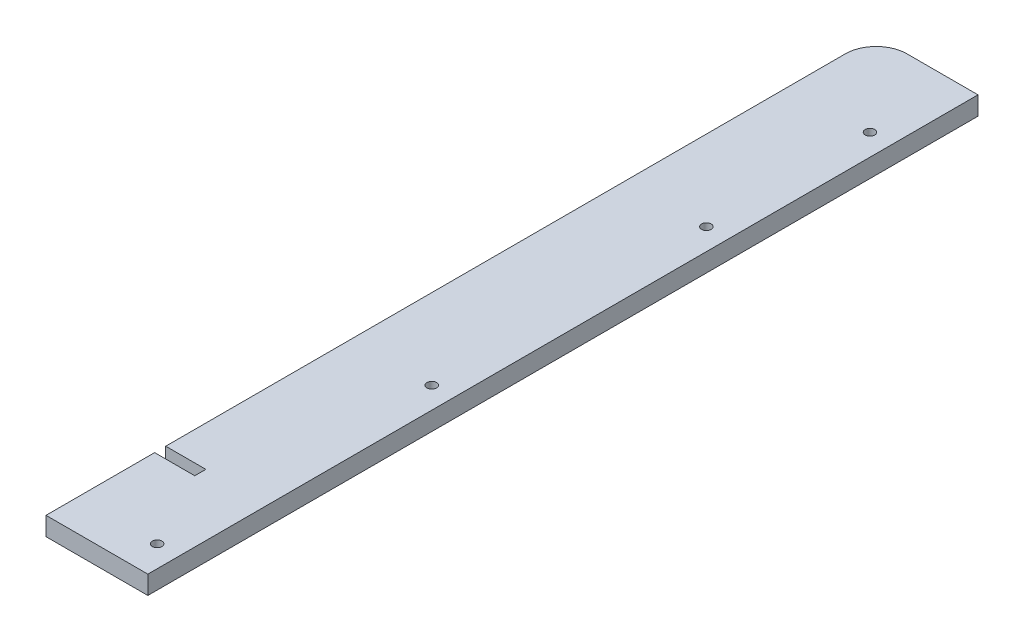
ISO-10303-21;
HEADER;
FILE_DESCRIPTION(('STEP AP214'),'2;1');
FILE_NAME('part.step','',(''),(''),'','','');
FILE_SCHEMA(('AUTOMOTIVE_DESIGN { 1 0 10303 214 1 1 1 1 }'));
ENDSEC;
DATA;
#1=APPLICATION_CONTEXT('core data for automotive mechanical design processes');
#2=APPLICATION_PROTOCOL_DEFINITION('international standard','automotive_design',2000,#1);
#3=PRODUCT_CONTEXT('',#1,'mechanical');
#4=PRODUCT('Part','Part','',(#3));
#5=PRODUCT_RELATED_PRODUCT_CATEGORY('part','',(#4));
#6=PRODUCT_DEFINITION_FORMATION('','',#4);
#7=PRODUCT_DEFINITION_CONTEXT('part definition',#1,'design');
#8=PRODUCT_DEFINITION('design','',#6,#7);
#9=PRODUCT_DEFINITION_SHAPE('','',#8);
#10=(LENGTH_UNIT() NAMED_UNIT(*) SI_UNIT(.MILLI.,.METRE.));
#11=(NAMED_UNIT(*) PLANE_ANGLE_UNIT() SI_UNIT($,.RADIAN.));
#12=(NAMED_UNIT(*) SI_UNIT($,.STERADIAN.) SOLID_ANGLE_UNIT());
#13=UNCERTAINTY_MEASURE_WITH_UNIT(LENGTH_MEASURE(1.E-05),#10,'distance_accuracy_value','');
#14=(GEOMETRIC_REPRESENTATION_CONTEXT(3) GLOBAL_UNCERTAINTY_ASSIGNED_CONTEXT((#13)) GLOBAL_UNIT_ASSIGNED_CONTEXT((#10,
#11,#12)) REPRESENTATION_CONTEXT('',''));
#15=CARTESIAN_POINT('',(0.,0.,0.));
#16=DIRECTION('',(0.,0.,1.));
#17=DIRECTION('',(1.,0.,0.));
#18=AXIS2_PLACEMENT_3D('',#15,#16,#17);
#19=CARTESIAN_POINT('',(-171.314966814714,1511.94738981776,-183.955224702686));
#20=DIRECTION('',(1.,0.,0.));
#21=DIRECTION('',(0.,0.,-1.));
#22=AXIS2_PLACEMENT_3D('',#19,#20,#21);
#23=PLANE('',#22);
#24=DIRECTION('',(0.,0.,1.));
#25=VECTOR('',#24,1.);
#26=CARTESIAN_POINT('',(-171.314966814714,1505.94738981776,0.));
#27=LINE('',#26,#25);
#28=CARTESIAN_POINT('',(-171.314966814714,1505.94738981776,-155.955224702686));
#29=VERTEX_POINT('',#28);
#30=CARTESIAN_POINT('',(-171.314966814714,1505.94738981776,64.2447752973141));
#31=VERTEX_POINT('',#30);
#32=EDGE_CURVE('E137',#29,#31,#27,.T.);
#33=ORIENTED_EDGE('',*,*,#32,.T.);
#34=DIRECTION('',(0.,1.,0.));
#35=VECTOR('',#34,1.);
#36=CARTESIAN_POINT('',(-171.314966814714,1501.94738981776,64.2447752973141));
#37=LINE('',#36,#35);
#38=CARTESIAN_POINT('',(-171.314966814714,1511.94738981776,64.2447752973141));
#39=VERTEX_POINT('',#38);
#40=EDGE_CURVE('E214',#31,#39,#37,.T.);
#41=ORIENTED_EDGE('',*,*,#40,.T.);
#42=DIRECTION('',(0.,0.,1.));
#43=VECTOR('',#42,1.);
#44=CARTESIAN_POINT('',(-171.314966814714,1511.94738981776,0.));
#45=LINE('',#44,#43);
#46=CARTESIAN_POINT('',(-171.314966814714,1511.94738981776,-155.955224702686));
#47=VERTEX_POINT('',#46);
#48=EDGE_CURVE('E132',#47,#39,#45,.T.);
#49=ORIENTED_EDGE('',*,*,#48,.F.);
#50=DIRECTION('',(0.,-1.,0.));
#51=VECTOR('',#50,1.);
#52=CARTESIAN_POINT('',(-171.314966814714,1511.94738981776,-155.955224702686));
#53=LINE('',#52,#51);
#54=EDGE_CURVE('E198',#47,#29,#53,.T.);
#55=ORIENTED_EDGE('',*,*,#54,.T.);
#56=EDGE_LOOP('',(#33,#41,#49,#55));
#57=FACE_BOUND('',#56,.T.);
#58=ADVANCED_FACE('F39',(#57),#23,.F.);
#59=CARTESIAN_POINT('',(-171.314966814714,1511.94738981776,67.8447752973141));
#60=VERTEX_POINT('',#59);
#61=CARTESIAN_POINT('',(-171.314966814714,1511.94738981776,103.044775297314));
#62=VERTEX_POINT('',#61);
#63=EDGE_CURVE('E123',#60,#62,#45,.T.);
#64=ORIENTED_EDGE('',*,*,#63,.F.);
#65=DIRECTION('',(0.,1.,0.));
#66=VECTOR('',#65,1.);
#67=CARTESIAN_POINT('',(-171.314966814714,1501.94738981776,67.8447752973141));
#68=LINE('',#67,#66);
#69=CARTESIAN_POINT('',(-171.314966814714,1505.94738981776,67.8447752973141));
#70=VERTEX_POINT('',#69);
#71=EDGE_CURVE('E107',#70,#60,#68,.T.);
#72=ORIENTED_EDGE('',*,*,#71,.F.);
#73=CARTESIAN_POINT('',(-171.314966814714,1505.94738981776,103.044775297314));
#74=VERTEX_POINT('',#73);
#75=EDGE_CURVE('E174',#70,#74,#27,.T.);
#76=ORIENTED_EDGE('',*,*,#75,.T.);
#77=DIRECTION('',(0.,-1.,0.));
#78=VECTOR('',#77,1.);
#79=CARTESIAN_POINT('',(-171.314966814714,1511.94738981776,103.044775297314));
#80=LINE('',#79,#78);
#81=EDGE_CURVE('E130',#62,#74,#80,.T.);
#82=ORIENTED_EDGE('',*,*,#81,.F.);
#83=EDGE_LOOP('',(#64,#72,#76,#82));
#84=FACE_BOUND('',#83,.T.);
#85=ADVANCED_FACE('F41',(#84),#23,.F.);
#86=CARTESIAN_POINT('',(693.685033185286,1511.94738981776,103.044775297314));
#87=DIRECTION('',(0.,0.,-1.));
#88=DIRECTION('',(-1.,0.,0.));
#89=AXIS2_PLACEMENT_3D('',#86,#87,#88);
#90=PLANE('',#89);
#91=DIRECTION('',(0.,1.,0.));
#92=VECTOR('',#91,1.);
#93=CARTESIAN_POINT('',(-138.314966814715,1505.94738981776,103.044775297314));
#94=LINE('',#93,#92);
#95=CARTESIAN_POINT('',(-138.314966814715,1505.94738981776,103.044775297314));
#96=VERTEX_POINT('',#95);
#97=CARTESIAN_POINT('',(-138.314966814715,1511.94738981776,103.044775297314));
#98=VERTEX_POINT('',#97);
#99=EDGE_CURVE('E178',#96,#98,#94,.T.);
#100=ORIENTED_EDGE('',*,*,#99,.T.);
#101=DIRECTION('',(1.,0.,0.));
#102=VECTOR('',#101,1.);
#103=CARTESIAN_POINT('',(693.685033185286,1511.94738981776,103.044775297314));
#104=LINE('',#103,#102);
#105=EDGE_CURVE('E135',#62,#98,#104,.T.);
#106=ORIENTED_EDGE('',*,*,#105,.F.);
#107=ORIENTED_EDGE('',*,*,#81,.T.);
#108=DIRECTION('',(1.,0.,0.));
#109=VECTOR('',#108,1.);
#110=CARTESIAN_POINT('',(693.685033185286,1505.94738981776,103.044775297314));
#111=LINE('',#110,#109);
#112=EDGE_CURVE('E133',#74,#96,#111,.T.);
#113=ORIENTED_EDGE('',*,*,#112,.T.);
#114=EDGE_LOOP('',(#100,#106,#107,#113));
#115=FACE_BOUND('',#114,.T.);
#116=ADVANCED_FACE('F241',(#115),#90,.F.);
#117=CARTESIAN_POINT('',(0.,1511.94738981776,0.));
#118=DIRECTION('',(0.,-1.,0.));
#119=DIRECTION('',(0.,0.,-1.));
#120=AXIS2_PLACEMENT_3D('',#117,#118,#119);
#121=PLANE('',#120);
#122=CARTESIAN_POINT('',(-145.314966814714,1511.94738981776,-137.955224702685));
#123=DIRECTION('',(0.,1.,0.));
#124=DIRECTION('',(0.,0.,1.));
#125=AXIS2_PLACEMENT_3D('',#122,#123,#124);
#126=CIRCLE('',#125,1.54999999999955);
#127=CARTESIAN_POINT('',(-145.314966814714,1511.94738981776,-136.405224702686));
#128=VERTEX_POINT('',#127);
#129=EDGE_CURVE('E163',#128,#128,#126,.T.);
#130=ORIENTED_EDGE('',*,*,#129,.F.);
#131=EDGE_LOOP('',(#130));
#132=FACE_BOUND('',#131,.T.);
#133=CARTESIAN_POINT('',(-145.314966814714,1511.94738981776,-84.9552247026854));
#134=DIRECTION('',(0.,1.,0.));
#135=DIRECTION('',(0.,0.,1.));
#136=AXIS2_PLACEMENT_3D('',#133,#134,#135);
#137=CIRCLE('',#136,1.54999999999999);
#138=CARTESIAN_POINT('',(-145.314966814714,1511.94738981776,-83.4052247026854));
#139=VERTEX_POINT('',#138);
#140=EDGE_CURVE('E159',#139,#139,#137,.T.);
#141=ORIENTED_EDGE('',*,*,#140,.F.);
#142=EDGE_LOOP('',(#141));
#143=FACE_BOUND('',#142,.T.);
#144=CARTESIAN_POINT('',(-145.314966814714,1511.94738981776,4.04477529731456));
#145=DIRECTION('',(0.,1.,0.));
#146=DIRECTION('',(0.,0.,1.));
#147=AXIS2_PLACEMENT_3D('',#144,#145,#146);
#148=CIRCLE('',#147,1.54999999999999);
#149=CARTESIAN_POINT('',(-145.314966814714,1511.94738981776,5.59477529731456));
#150=VERTEX_POINT('',#149);
#151=EDGE_CURVE('E155',#150,#150,#148,.T.);
#152=ORIENTED_EDGE('',*,*,#151,.F.);
#153=EDGE_LOOP('',(#152));
#154=FACE_BOUND('',#153,.T.);
#155=CARTESIAN_POINT('',(-145.314966814714,1511.94738981776,93.0447752973146));
#156=DIRECTION('',(0.,1.,0.));
#157=DIRECTION('',(0.,0.,1.));
#158=AXIS2_PLACEMENT_3D('',#155,#156,#157);
#159=CIRCLE('',#158,1.54999999999955);
#160=CARTESIAN_POINT('',(-145.314966814714,1511.94738981776,94.5947752973141));
#161=VERTEX_POINT('',#160);
#162=EDGE_CURVE('E151',#161,#161,#159,.T.);
#163=ORIENTED_EDGE('',*,*,#162,.F.);
#164=EDGE_LOOP('',(#163));
#165=FACE_BOUND('',#164,.T.);
#166=ORIENTED_EDGE('',*,*,#48,.T.);
#167=DIRECTION('',(-1.,0.,0.));
#168=VECTOR('',#167,1.);
#169=CARTESIAN_POINT('',(-171.314966814714,1511.94738981776,64.2447752973141));
#170=LINE('',#169,#168);
#171=CARTESIAN_POINT('',(-158.314966814714,1511.94738981776,64.2447752973141));
#172=VERTEX_POINT('',#171);
#173=EDGE_CURVE('E117',#172,#39,#170,.T.);
#174=ORIENTED_EDGE('',*,*,#173,.F.);
#175=DIRECTION('',(0.,0.,-1.));
#176=VECTOR('',#175,1.);
#177=CARTESIAN_POINT('',(-158.314966814714,1511.94738981776,64.2447752973141));
#178=LINE('',#177,#176);
#179=CARTESIAN_POINT('',(-158.314966814714,1511.94738981776,67.8447752973141));
#180=VERTEX_POINT('',#179);
#181=EDGE_CURVE('E127',#180,#172,#178,.T.);
#182=ORIENTED_EDGE('',*,*,#181,.F.);
#183=DIRECTION('',(1.,0.,0.));
#184=VECTOR('',#183,1.);
#185=CARTESIAN_POINT('',(-171.314966814714,1511.94738981776,67.8447752973141));
#186=LINE('',#185,#184);
#187=EDGE_CURVE('E110',#60,#180,#186,.T.);
#188=ORIENTED_EDGE('',*,*,#187,.F.);
#189=ORIENTED_EDGE('',*,*,#63,.T.);
#190=ORIENTED_EDGE('',*,*,#105,.T.);
#191=DIRECTION('',(0.,0.,1.));
#192=VECTOR('',#191,1.);
#193=CARTESIAN_POINT('',(-138.314966814715,1511.94738981776,-153.955224702686));
#194=LINE('',#193,#192);
#195=CARTESIAN_POINT('',(-138.314966814715,1511.94738981776,-165.955224702686));
#196=VERTEX_POINT('',#195);
#197=EDGE_CURVE('E175',#196,#98,#194,.T.);
#198=ORIENTED_EDGE('',*,*,#197,.F.);
#199=DIRECTION('',(1.,0.,0.));
#200=VECTOR('',#199,1.);
#201=CARTESIAN_POINT('',(-171.314966814714,1511.94738981776,-165.955224702686));
#202=LINE('',#201,#200);
#203=CARTESIAN_POINT('',(-161.314966814714,1511.94738981776,-165.955224702686));
#204=VERTEX_POINT('',#203);
#205=EDGE_CURVE('E197',#204,#196,#202,.T.);
#206=ORIENTED_EDGE('',*,*,#205,.F.);
#207=CARTESIAN_POINT('',(-161.314966814714,1511.94738981776,-155.955224702686));
#208=DIRECTION('',(0.,1.,0.));
#209=DIRECTION('',(0.,0.,1.));
#210=AXIS2_PLACEMENT_3D('',#207,#208,#209);
#211=CIRCLE('',#210,9.99999999999993);
#212=EDGE_CURVE('E62',#204,#47,#211,.T.);
#213=ORIENTED_EDGE('',*,*,#212,.T.);
#214=EDGE_LOOP('',(#166,#174,#182,#188,#189,#190,#198,#206,#213));
#215=FACE_BOUND('',#214,.T.);
#216=ADVANCED_FACE('F121',(#132,#143,#154,#165,#215),#121,.F.);
#217=CARTESIAN_POINT('',(0.,1505.94738981776,0.));
#218=DIRECTION('',(0.,-1.,0.));
#219=DIRECTION('',(0.,0.,-1.));
#220=AXIS2_PLACEMENT_3D('',#217,#218,#219);
#221=PLANE('',#220);
#222=DIRECTION('',(1.,0.,0.));
#223=VECTOR('',#222,1.);
#224=CARTESIAN_POINT('',(0.,1505.94738981776,64.2447752973139));
#225=LINE('',#224,#223);
#226=CARTESIAN_POINT('',(-158.314966814714,1505.94738981776,64.2447752973141));
#227=VERTEX_POINT('',#226);
#228=EDGE_CURVE('E13',#31,#227,#225,.T.);
#229=ORIENTED_EDGE('',*,*,#228,.F.);
#230=ORIENTED_EDGE('',*,*,#32,.F.);
#231=CARTESIAN_POINT('',(-161.314966814714,1505.94738981776,-155.955224702686));
#232=DIRECTION('',(0.,1.,0.));
#233=DIRECTION('',(0.,0.,1.));
#234=AXIS2_PLACEMENT_3D('',#231,#232,#233);
#235=CIRCLE('',#234,9.99999999999993);
#236=CARTESIAN_POINT('',(-161.314966814714,1505.94738981776,-165.955224702686));
#237=VERTEX_POINT('',#236);
#238=EDGE_CURVE('E150',#237,#29,#235,.T.);
#239=ORIENTED_EDGE('',*,*,#238,.F.);
#240=DIRECTION('',(-1.,0.,0.));
#241=VECTOR('',#240,1.);
#242=CARTESIAN_POINT('',(2.79162593214797E-13,1505.94738981776,-165.955224702686));
#243=LINE('',#242,#241);
#244=CARTESIAN_POINT('',(-138.314966814715,1505.94738981776,-165.955224702686));
#245=VERTEX_POINT('',#244);
#246=EDGE_CURVE('E186',#245,#237,#243,.T.);
#247=ORIENTED_EDGE('',*,*,#246,.F.);
#248=DIRECTION('',(0.,0.,-1.));
#249=VECTOR('',#248,1.);
#250=CARTESIAN_POINT('',(-138.314966814715,1505.94738981776,0.));
#251=LINE('',#250,#249);
#252=EDGE_CURVE('E143',#96,#245,#251,.T.);
#253=ORIENTED_EDGE('',*,*,#252,.F.);
#254=ORIENTED_EDGE('',*,*,#112,.F.);
#255=ORIENTED_EDGE('',*,*,#75,.F.);
#256=DIRECTION('',(-1.,0.,0.));
#257=VECTOR('',#256,1.);
#258=CARTESIAN_POINT('',(0.,1505.94738981776,67.8447752973141));
#259=LINE('',#258,#257);
#260=CARTESIAN_POINT('',(-158.314966814714,1505.94738981776,67.8447752973141));
#261=VERTEX_POINT('',#260);
#262=EDGE_CURVE('E113',#261,#70,#259,.T.);
#263=ORIENTED_EDGE('',*,*,#262,.F.);
#264=DIRECTION('',(0.,0.,1.));
#265=VECTOR('',#264,1.);
#266=CARTESIAN_POINT('',(-158.314966814714,1505.94738981776,0.));
#267=LINE('',#266,#265);
#268=EDGE_CURVE('E47',#227,#261,#267,.T.);
#269=ORIENTED_EDGE('',*,*,#268,.F.);
#270=EDGE_LOOP('',(#229,#230,#239,#247,#253,#254,#255,#263,#269));
#271=FACE_BOUND('',#270,.T.);
#272=CARTESIAN_POINT('',(-145.314966814714,1505.94738981776,-137.955224702685));
#273=DIRECTION('',(0.,-1.,0.));
#274=DIRECTION('',(0.,0.,-1.));
#275=AXIS2_PLACEMENT_3D('',#272,#273,#274);
#276=CIRCLE('',#275,1.54999999999955);
#277=CARTESIAN_POINT('',(-145.314966814714,1505.94738981776,-139.505224702685));
#278=VERTEX_POINT('',#277);
#279=EDGE_CURVE('E160',#278,#278,#276,.T.);
#280=ORIENTED_EDGE('',*,*,#279,.F.);
#281=EDGE_LOOP('',(#280));
#282=FACE_BOUND('',#281,.T.);
#283=CARTESIAN_POINT('',(-145.314966814714,1505.94738981776,-84.9552247026854));
#284=DIRECTION('',(0.,-1.,0.));
#285=DIRECTION('',(0.,0.,-1.));
#286=AXIS2_PLACEMENT_3D('',#283,#284,#285);
#287=CIRCLE('',#286,1.54999999999999);
#288=CARTESIAN_POINT('',(-145.314966814714,1505.94738981776,-86.5052247026854));
#289=VERTEX_POINT('',#288);
#290=EDGE_CURVE('E156',#289,#289,#287,.T.);
#291=ORIENTED_EDGE('',*,*,#290,.F.);
#292=EDGE_LOOP('',(#291));
#293=FACE_BOUND('',#292,.T.);
#294=CARTESIAN_POINT('',(-145.314966814714,1505.94738981776,4.04477529731456));
#295=DIRECTION('',(0.,-1.,0.));
#296=DIRECTION('',(0.,0.,-1.));
#297=AXIS2_PLACEMENT_3D('',#294,#295,#296);
#298=CIRCLE('',#297,1.54999999999999);
#299=CARTESIAN_POINT('',(-145.314966814714,1505.94738981776,2.49477529731457));
#300=VERTEX_POINT('',#299);
#301=EDGE_CURVE('E152',#300,#300,#298,.T.);
#302=ORIENTED_EDGE('',*,*,#301,.F.);
#303=EDGE_LOOP('',(#302));
#304=FACE_BOUND('',#303,.T.);
#305=CARTESIAN_POINT('',(-145.314966814714,1505.94738981776,93.0447752973146));
#306=DIRECTION('',(0.,-1.,0.));
#307=DIRECTION('',(0.,0.,-1.));
#308=AXIS2_PLACEMENT_3D('',#305,#306,#307);
#309=CIRCLE('',#308,1.54999999999955);
#310=CARTESIAN_POINT('',(-145.314966814714,1505.94738981776,91.494775297315));
#311=VERTEX_POINT('',#310);
#312=EDGE_CURVE('E147',#311,#311,#309,.T.);
#313=ORIENTED_EDGE('',*,*,#312,.F.);
#314=EDGE_LOOP('',(#313));
#315=FACE_BOUND('',#314,.T.);
#316=ADVANCED_FACE('F171',(#271,#282,#293,#304,#315),#221,.T.);
#317=CARTESIAN_POINT('',(-138.314966814715,1501.94738981776,-153.955224702686));
#318=DIRECTION('',(-1.,0.,0.));
#319=DIRECTION('',(0.,0.,1.));
#320=AXIS2_PLACEMENT_3D('',#317,#318,#319);
#321=PLANE('',#320);
#322=ORIENTED_EDGE('',*,*,#252,.T.);
#323=DIRECTION('',(0.,1.,0.));
#324=VECTOR('',#323,1.);
#325=CARTESIAN_POINT('',(-138.314966814715,1501.94738981776,-165.955224702686));
#326=LINE('',#325,#324);
#327=EDGE_CURVE('E144',#245,#196,#326,.T.);
#328=ORIENTED_EDGE('',*,*,#327,.T.);
#329=ORIENTED_EDGE('',*,*,#197,.T.);
#330=ORIENTED_EDGE('',*,*,#99,.F.);
#331=EDGE_LOOP('',(#322,#328,#329,#330));
#332=FACE_BOUND('',#331,.T.);
#333=ADVANCED_FACE('F191',(#332),#321,.F.);
#334=CARTESIAN_POINT('',(-171.314966814714,1501.94738981776,-165.955224702686));
#335=DIRECTION('',(0.,0.,1.));
#336=DIRECTION('',(1.,0.,0.));
#337=AXIS2_PLACEMENT_3D('',#334,#335,#336);
#338=PLANE('',#337);
#339=ORIENTED_EDGE('',*,*,#246,.T.);
#340=DIRECTION('',(0.,-1.,0.));
#341=VECTOR('',#340,1.);
#342=CARTESIAN_POINT('',(-161.314966814714,1511.94738981776,-165.955224702686));
#343=LINE('',#342,#341);
#344=EDGE_CURVE('E201',#204,#237,#343,.T.);
#345=ORIENTED_EDGE('',*,*,#344,.F.);
#346=ORIENTED_EDGE('',*,*,#205,.T.);
#347=ORIENTED_EDGE('',*,*,#327,.F.);
#348=EDGE_LOOP('',(#339,#345,#346,#347));
#349=FACE_BOUND('',#348,.T.);
#350=ADVANCED_FACE('F227',(#349),#338,.F.);
#351=CARTESIAN_POINT('',(-161.314966814714,1511.94738981776,-155.955224702686));
#352=DIRECTION('',(0.,-1.,0.));
#353=DIRECTION('',(0.,0.,-1.));
#354=AXIS2_PLACEMENT_3D('',#351,#352,#353);
#355=CYLINDRICAL_SURFACE('',#354,9.99999999999993);
#356=ORIENTED_EDGE('',*,*,#238,.T.);
#357=ORIENTED_EDGE('',*,*,#54,.F.);
#358=ORIENTED_EDGE('',*,*,#212,.F.);
#359=ORIENTED_EDGE('',*,*,#344,.T.);
#360=EDGE_LOOP('',(#356,#357,#358,#359));
#361=FACE_BOUND('',#360,.T.);
#362=ADVANCED_FACE('F225',(#361),#355,.T.);
#363=CARTESIAN_POINT('',(-145.314966814714,1501.94738981776,93.0447752973146));
#364=DIRECTION('',(0.,1.,0.));
#365=DIRECTION('',(0.,0.,1.));
#366=AXIS2_PLACEMENT_3D('',#363,#364,#365);
#367=CYLINDRICAL_SURFACE('',#366,1.54999999999955);
#368=ORIENTED_EDGE('',*,*,#312,.T.);
#369=EDGE_LOOP('',(#368));
#370=FACE_BOUND('',#369,.T.);
#371=ORIENTED_EDGE('',*,*,#162,.T.);
#372=EDGE_LOOP('',(#371));
#373=FACE_BOUND('',#372,.T.);
#374=ADVANCED_FACE('F234',(#370,#373),#367,.F.);
#375=CARTESIAN_POINT('',(-145.314966814714,1501.94738981776,4.04477529731456));
#376=DIRECTION('',(0.,1.,0.));
#377=DIRECTION('',(0.,0.,1.));
#378=AXIS2_PLACEMENT_3D('',#375,#376,#377);
#379=CYLINDRICAL_SURFACE('',#378,1.54999999999999);
#380=ORIENTED_EDGE('',*,*,#301,.T.);
#381=EDGE_LOOP('',(#380));
#382=FACE_BOUND('',#381,.T.);
#383=ORIENTED_EDGE('',*,*,#151,.T.);
#384=EDGE_LOOP('',(#383));
#385=FACE_BOUND('',#384,.T.);
#386=ADVANCED_FACE('F285',(#382,#385),#379,.F.);
#387=CARTESIAN_POINT('',(-145.314966814714,1501.94738981776,-84.9552247026854));
#388=DIRECTION('',(0.,1.,0.));
#389=DIRECTION('',(0.,0.,1.));
#390=AXIS2_PLACEMENT_3D('',#387,#388,#389);
#391=CYLINDRICAL_SURFACE('',#390,1.54999999999999);
#392=ORIENTED_EDGE('',*,*,#290,.T.);
#393=EDGE_LOOP('',(#392));
#394=FACE_BOUND('',#393,.T.);
#395=ORIENTED_EDGE('',*,*,#140,.T.);
#396=EDGE_LOOP('',(#395));
#397=FACE_BOUND('',#396,.T.);
#398=ADVANCED_FACE('F295',(#394,#397),#391,.F.);
#399=CARTESIAN_POINT('',(-145.314966814714,1501.94738981776,-137.955224702685));
#400=DIRECTION('',(0.,1.,0.));
#401=DIRECTION('',(0.,0.,1.));
#402=AXIS2_PLACEMENT_3D('',#399,#400,#401);
#403=CYLINDRICAL_SURFACE('',#402,1.54999999999955);
#404=ORIENTED_EDGE('',*,*,#279,.T.);
#405=EDGE_LOOP('',(#404));
#406=FACE_BOUND('',#405,.T.);
#407=ORIENTED_EDGE('',*,*,#129,.T.);
#408=EDGE_LOOP('',(#407));
#409=FACE_BOUND('',#408,.T.);
#410=ADVANCED_FACE('F305',(#406,#409),#403,.F.);
#411=CARTESIAN_POINT('',(-171.314966814714,1501.94738981776,64.2447752973141));
#412=DIRECTION('',(0.,0.,-1.));
#413=DIRECTION('',(-1.,0.,0.));
#414=AXIS2_PLACEMENT_3D('',#411,#412,#413);
#415=PLANE('',#414);
#416=ORIENTED_EDGE('',*,*,#228,.T.);
#417=DIRECTION('',(0.,1.,0.));
#418=VECTOR('',#417,1.);
#419=CARTESIAN_POINT('',(-158.314966814714,1501.94738981776,64.2447752973141));
#420=LINE('',#419,#418);
#421=EDGE_CURVE('E168',#227,#172,#420,.T.);
#422=ORIENTED_EDGE('',*,*,#421,.T.);
#423=ORIENTED_EDGE('',*,*,#173,.T.);
#424=ORIENTED_EDGE('',*,*,#40,.F.);
#425=EDGE_LOOP('',(#416,#422,#423,#424));
#426=FACE_BOUND('',#425,.T.);
#427=ADVANCED_FACE('F223',(#426),#415,.F.);
#428=CARTESIAN_POINT('',(-158.314966814714,1501.94738981776,64.2447752973141));
#429=DIRECTION('',(1.,0.,0.));
#430=DIRECTION('',(0.,0.,-1.));
#431=AXIS2_PLACEMENT_3D('',#428,#429,#430);
#432=PLANE('',#431);
#433=ORIENTED_EDGE('',*,*,#268,.T.);
#434=DIRECTION('',(0.,1.,0.));
#435=VECTOR('',#434,1.);
#436=CARTESIAN_POINT('',(-158.314966814714,1501.94738981776,67.8447752973141));
#437=LINE('',#436,#435);
#438=EDGE_CURVE('E54',#261,#180,#437,.T.);
#439=ORIENTED_EDGE('',*,*,#438,.T.);
#440=ORIENTED_EDGE('',*,*,#181,.T.);
#441=ORIENTED_EDGE('',*,*,#421,.F.);
#442=EDGE_LOOP('',(#433,#439,#440,#441));
#443=FACE_BOUND('',#442,.T.);
#444=ADVANCED_FACE('F167',(#443),#432,.F.);
#445=CARTESIAN_POINT('',(-171.314966814714,1501.94738981776,67.8447752973141));
#446=DIRECTION('',(0.,0.,1.));
#447=DIRECTION('',(1.,0.,0.));
#448=AXIS2_PLACEMENT_3D('',#445,#446,#447);
#449=PLANE('',#448);
#450=ORIENTED_EDGE('',*,*,#262,.T.);
#451=ORIENTED_EDGE('',*,*,#71,.T.);
#452=ORIENTED_EDGE('',*,*,#187,.T.);
#453=ORIENTED_EDGE('',*,*,#438,.F.);
#454=EDGE_LOOP('',(#450,#451,#452,#453));
#455=FACE_BOUND('',#454,.T.);
#456=ADVANCED_FACE('F109',(#455),#449,.F.);
#457=CLOSED_SHELL('',(#58,#85,#116,#216,#316,#333,#350,#362,#374,#386,#398,#410,#427,#444,#456));
#458=MANIFOLD_SOLID_BREP('B2',#457);
#459=ADVANCED_BREP_SHAPE_REPRESENTATION('',(#18,#458),#14);
#460=SHAPE_DEFINITION_REPRESENTATION(#9,#459);
ENDSEC;
END-ISO-10303-21;
